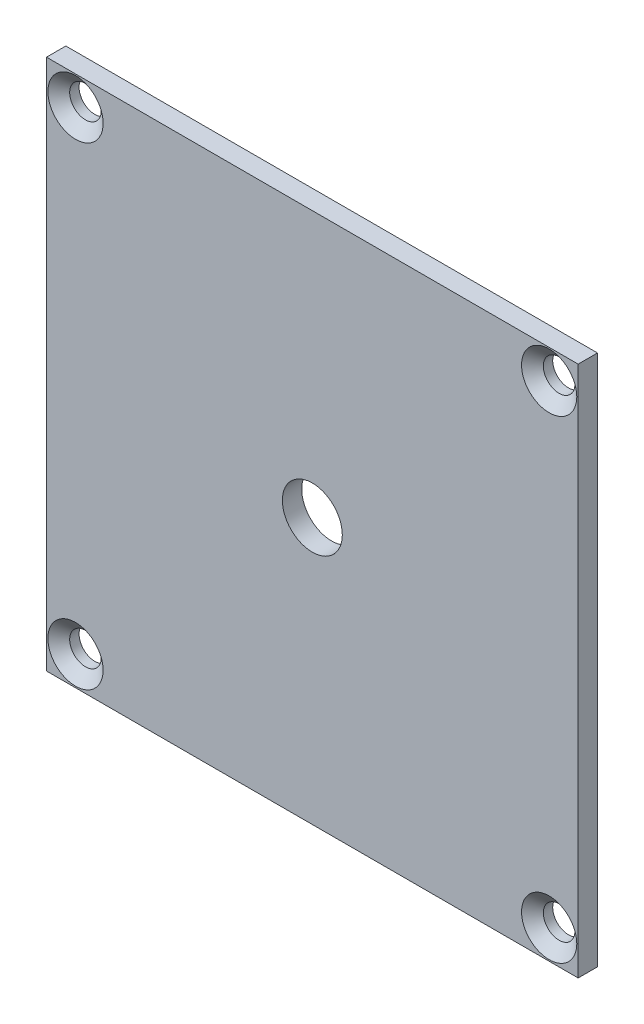
ISO-10303-21;
HEADER;
FILE_DESCRIPTION(('STEP AP214'),'2;1');
FILE_NAME('part.step','',(''),(''),'','','');
FILE_SCHEMA(('AUTOMOTIVE_DESIGN { 1 0 10303 214 1 1 1 1 }'));
ENDSEC;
DATA;
#1=APPLICATION_CONTEXT('core data for automotive mechanical design processes');
#2=APPLICATION_PROTOCOL_DEFINITION('international standard','automotive_design',2000,#1);
#3=PRODUCT_CONTEXT('',#1,'mechanical');
#4=PRODUCT('Part','Part','',(#3));
#5=PRODUCT_RELATED_PRODUCT_CATEGORY('part','',(#4));
#6=PRODUCT_DEFINITION_FORMATION('','',#4);
#7=PRODUCT_DEFINITION_CONTEXT('part definition',#1,'design');
#8=PRODUCT_DEFINITION('design','',#6,#7);
#9=PRODUCT_DEFINITION_SHAPE('','',#8);
#10=(LENGTH_UNIT() NAMED_UNIT(*) SI_UNIT(.MILLI.,.METRE.));
#11=(NAMED_UNIT(*) PLANE_ANGLE_UNIT() SI_UNIT($,.RADIAN.));
#12=(NAMED_UNIT(*) SI_UNIT($,.STERADIAN.) SOLID_ANGLE_UNIT());
#13=UNCERTAINTY_MEASURE_WITH_UNIT(LENGTH_MEASURE(1.E-05),#10,'distance_accuracy_value','');
#14=(GEOMETRIC_REPRESENTATION_CONTEXT(3) GLOBAL_UNCERTAINTY_ASSIGNED_CONTEXT((#13)) GLOBAL_UNIT_ASSIGNED_CONTEXT((#10,
#11,#12)) REPRESENTATION_CONTEXT('',''));
#15=CARTESIAN_POINT('',(0.,0.,0.));
#16=DIRECTION('',(0.,0.,1.));
#17=DIRECTION('',(1.,0.,0.));
#18=AXIS2_PLACEMENT_3D('',#15,#16,#17);
#19=CARTESIAN_POINT('',(0.,0.,2.));
#20=DIRECTION('',(1.,0.,0.));
#21=DIRECTION('',(0.,1.,0.));
#22=AXIS2_PLACEMENT_3D('',#19,#20,#21);
#23=PLANE('',#22);
#24=DIRECTION('',(0.,-1.,0.));
#25=VECTOR('',#24,1.);
#26=CARTESIAN_POINT('',(0.,0.,0.));
#27=LINE('',#26,#25);
#28=CARTESIAN_POINT('',(0.,55.,0.));
#29=VERTEX_POINT('',#28);
#30=CARTESIAN_POINT('',(0.,0.,0.));
#31=VERTEX_POINT('',#30);
#32=EDGE_CURVE('E107',#29,#31,#27,.T.);
#33=ORIENTED_EDGE('',*,*,#32,.T.);
#34=DIRECTION('',(0.,0.,-1.));
#35=VECTOR('',#34,1.);
#36=CARTESIAN_POINT('',(0.,0.,2.));
#37=LINE('',#36,#35);
#38=CARTESIAN_POINT('',(0.,0.,2.));
#39=VERTEX_POINT('',#38);
#40=EDGE_CURVE('E11',#39,#31,#37,.T.);
#41=ORIENTED_EDGE('',*,*,#40,.F.);
#42=DIRECTION('',(0.,-1.,0.));
#43=VECTOR('',#42,1.);
#44=CARTESIAN_POINT('',(0.,0.,2.));
#45=LINE('',#44,#43);
#46=CARTESIAN_POINT('',(0.,55.,2.));
#47=VERTEX_POINT('',#46);
#48=EDGE_CURVE('E91',#47,#39,#45,.T.);
#49=ORIENTED_EDGE('',*,*,#48,.F.);
#50=DIRECTION('',(0.,0.,-1.));
#51=VECTOR('',#50,1.);
#52=CARTESIAN_POINT('',(0.,55.,2.));
#53=LINE('',#52,#51);
#54=EDGE_CURVE('E103',#47,#29,#53,.T.);
#55=ORIENTED_EDGE('',*,*,#54,.T.);
#56=EDGE_LOOP('',(#33,#41,#49,#55));
#57=FACE_BOUND('',#56,.T.);
#58=ADVANCED_FACE('F39',(#57),#23,.F.);
#59=CARTESIAN_POINT('',(0.,0.,2.));
#60=DIRECTION('',(0.,1.,0.));
#61=DIRECTION('',(0.,0.,1.));
#62=AXIS2_PLACEMENT_3D('',#59,#60,#61);
#63=PLANE('',#62);
#64=DIRECTION('',(1.,0.,0.));
#65=VECTOR('',#64,1.);
#66=CARTESIAN_POINT('',(0.,0.,0.));
#67=LINE('',#66,#65);
#68=CARTESIAN_POINT('',(55.,0.,0.));
#69=VERTEX_POINT('',#68);
#70=EDGE_CURVE('E96',#31,#69,#67,.T.);
#71=ORIENTED_EDGE('',*,*,#70,.T.);
#72=DIRECTION('',(0.,0.,-1.));
#73=VECTOR('',#72,1.);
#74=CARTESIAN_POINT('',(55.,0.,2.));
#75=LINE('',#74,#73);
#76=CARTESIAN_POINT('',(55.,0.,2.));
#77=VERTEX_POINT('',#76);
#78=EDGE_CURVE('E48',#77,#69,#75,.T.);
#79=ORIENTED_EDGE('',*,*,#78,.F.);
#80=DIRECTION('',(1.,0.,0.));
#81=VECTOR('',#80,1.);
#82=CARTESIAN_POINT('',(0.,0.,2.));
#83=LINE('',#82,#81);
#84=EDGE_CURVE('E86',#39,#77,#83,.T.);
#85=ORIENTED_EDGE('',*,*,#84,.F.);
#86=ORIENTED_EDGE('',*,*,#40,.T.);
#87=EDGE_LOOP('',(#71,#79,#85,#86));
#88=FACE_BOUND('',#87,.T.);
#89=ADVANCED_FACE('F95',(#88),#63,.F.);
#90=CARTESIAN_POINT('',(55.,0.,2.));
#91=DIRECTION('',(-1.,0.,0.));
#92=DIRECTION('',(0.,-1.,0.));
#93=AXIS2_PLACEMENT_3D('',#90,#91,#92);
#94=PLANE('',#93);
#95=DIRECTION('',(0.,1.,0.));
#96=VECTOR('',#95,1.);
#97=CARTESIAN_POINT('',(55.,0.,0.));
#98=LINE('',#97,#96);
#99=CARTESIAN_POINT('',(55.,55.,0.));
#100=VERTEX_POINT('',#99);
#101=EDGE_CURVE('E73',#69,#100,#98,.T.);
#102=ORIENTED_EDGE('',*,*,#101,.T.);
#103=DIRECTION('',(0.,0.,-1.));
#104=VECTOR('',#103,1.);
#105=CARTESIAN_POINT('',(55.,55.,2.));
#106=LINE('',#105,#104);
#107=CARTESIAN_POINT('',(55.,55.,2.));
#108=VERTEX_POINT('',#107);
#109=EDGE_CURVE('E98',#108,#100,#106,.T.);
#110=ORIENTED_EDGE('',*,*,#109,.F.);
#111=DIRECTION('',(0.,1.,0.));
#112=VECTOR('',#111,1.);
#113=CARTESIAN_POINT('',(55.,0.,2.));
#114=LINE('',#113,#112);
#115=EDGE_CURVE('E89',#77,#108,#114,.T.);
#116=ORIENTED_EDGE('',*,*,#115,.F.);
#117=ORIENTED_EDGE('',*,*,#78,.T.);
#118=EDGE_LOOP('',(#102,#110,#116,#117));
#119=FACE_BOUND('',#118,.T.);
#120=ADVANCED_FACE('F99',(#119),#94,.F.);
#121=CARTESIAN_POINT('',(0.,55.,2.));
#122=DIRECTION('',(0.,-1.,0.));
#123=DIRECTION('',(0.,0.,-1.));
#124=AXIS2_PLACEMENT_3D('',#121,#122,#123);
#125=PLANE('',#124);
#126=DIRECTION('',(-1.,0.,0.));
#127=VECTOR('',#126,1.);
#128=CARTESIAN_POINT('',(0.,55.,0.));
#129=LINE('',#128,#127);
#130=EDGE_CURVE('E79',#100,#29,#129,.T.);
#131=ORIENTED_EDGE('',*,*,#130,.T.);
#132=ORIENTED_EDGE('',*,*,#54,.F.);
#133=DIRECTION('',(-1.,0.,0.));
#134=VECTOR('',#133,1.);
#135=CARTESIAN_POINT('',(0.,55.,2.));
#136=LINE('',#135,#134);
#137=EDGE_CURVE('E56',#108,#47,#136,.T.);
#138=ORIENTED_EDGE('',*,*,#137,.F.);
#139=ORIENTED_EDGE('',*,*,#109,.T.);
#140=EDGE_LOOP('',(#131,#132,#138,#139));
#141=FACE_BOUND('',#140,.T.);
#142=ADVANCED_FACE('F121',(#141),#125,.F.);
#143=CARTESIAN_POINT('',(0.,0.,2.));
#144=DIRECTION('',(0.,0.,-1.));
#145=DIRECTION('',(-1.,0.,0.));
#146=AXIS2_PLACEMENT_3D('',#143,#144,#145);
#147=PLANE('',#146);
#148=CARTESIAN_POINT('',(2.99999999999998,52.,2.));
#149=DIRECTION('',(0.,0.,1.));
#150=DIRECTION('',(1.,0.,0.));
#151=AXIS2_PLACEMENT_3D('',#148,#149,#150);
#152=CIRCLE('',#151,2.8575);
#153=CARTESIAN_POINT('',(5.85749999999998,52.,2.));
#154=VERTEX_POINT('',#153);
#155=EDGE_CURVE('E179',#154,#154,#152,.T.);
#156=ORIENTED_EDGE('',*,*,#155,.F.);
#157=EDGE_LOOP('',(#156));
#158=FACE_BOUND('',#157,.T.);
#159=CARTESIAN_POINT('',(52.,52.,2.));
#160=DIRECTION('',(0.,0.,1.));
#161=DIRECTION('',(1.,0.,0.));
#162=AXIS2_PLACEMENT_3D('',#159,#160,#161);
#163=CIRCLE('',#162,2.8575);
#164=CARTESIAN_POINT('',(54.8575,52.,2.));
#165=VERTEX_POINT('',#164);
#166=EDGE_CURVE('E167',#165,#165,#163,.T.);
#167=ORIENTED_EDGE('',*,*,#166,.F.);
#168=EDGE_LOOP('',(#167));
#169=FACE_BOUND('',#168,.T.);
#170=CARTESIAN_POINT('',(52.,3.00000000000001,2.));
#171=DIRECTION('',(0.,0.,1.));
#172=DIRECTION('',(1.,0.,0.));
#173=AXIS2_PLACEMENT_3D('',#170,#171,#172);
#174=CIRCLE('',#173,2.8575);
#175=CARTESIAN_POINT('',(54.8575,3.00000000000001,2.));
#176=VERTEX_POINT('',#175);
#177=EDGE_CURVE('E155',#176,#176,#174,.T.);
#178=ORIENTED_EDGE('',*,*,#177,.F.);
#179=EDGE_LOOP('',(#178));
#180=FACE_BOUND('',#179,.T.);
#181=CARTESIAN_POINT('',(2.99999999999998,3.00000000000001,2.));
#182=DIRECTION('',(0.,0.,1.));
#183=DIRECTION('',(1.,0.,0.));
#184=AXIS2_PLACEMENT_3D('',#181,#182,#183);
#185=CIRCLE('',#184,2.8575);
#186=CARTESIAN_POINT('',(5.85749999999998,3.00000000000001,2.));
#187=VERTEX_POINT('',#186);
#188=EDGE_CURVE('E143',#187,#187,#185,.T.);
#189=ORIENTED_EDGE('',*,*,#188,.F.);
#190=EDGE_LOOP('',(#189));
#191=FACE_BOUND('',#190,.T.);
#192=CARTESIAN_POINT('',(27.5,27.5,2.));
#193=DIRECTION('',(0.,0.,1.));
#194=DIRECTION('',(1.,0.,0.));
#195=AXIS2_PLACEMENT_3D('',#192,#193,#194);
#196=CIRCLE('',#195,3.1);
#197=CARTESIAN_POINT('',(30.6,27.5,2.));
#198=VERTEX_POINT('',#197);
#199=EDGE_CURVE('E128',#198,#198,#196,.T.);
#200=ORIENTED_EDGE('',*,*,#199,.F.);
#201=EDGE_LOOP('',(#200));
#202=FACE_BOUND('',#201,.T.);
#203=ORIENTED_EDGE('',*,*,#48,.T.);
#204=ORIENTED_EDGE('',*,*,#84,.T.);
#205=ORIENTED_EDGE('',*,*,#115,.T.);
#206=ORIENTED_EDGE('',*,*,#137,.T.);
#207=EDGE_LOOP('',(#203,#204,#205,#206));
#208=FACE_BOUND('',#207,.T.);
#209=ADVANCED_FACE('F87',(#158,#169,#180,#191,#202,#208),#147,.F.);
#210=CARTESIAN_POINT('',(0.,0.,0.));
#211=DIRECTION('',(0.,0.,-1.));
#212=DIRECTION('',(-1.,0.,0.));
#213=AXIS2_PLACEMENT_3D('',#210,#211,#212);
#214=PLANE('',#213);
#215=CARTESIAN_POINT('',(2.99999999999998,52.,0.));
#216=DIRECTION('',(0.,0.,1.));
#217=DIRECTION('',(1.,0.,0.));
#218=AXIS2_PLACEMENT_3D('',#215,#216,#217);
#219=CIRCLE('',#218,1.63195);
#220=CARTESIAN_POINT('',(4.63194999999998,52.,0.));
#221=VERTEX_POINT('',#220);
#222=EDGE_CURVE('E171',#221,#221,#219,.T.);
#223=ORIENTED_EDGE('',*,*,#222,.T.);
#224=EDGE_LOOP('',(#223));
#225=FACE_BOUND('',#224,.T.);
#226=CARTESIAN_POINT('',(52.,52.,0.));
#227=DIRECTION('',(0.,0.,1.));
#228=DIRECTION('',(1.,0.,0.));
#229=AXIS2_PLACEMENT_3D('',#226,#227,#228);
#230=CIRCLE('',#229,1.63195);
#231=CARTESIAN_POINT('',(53.63195,52.,0.));
#232=VERTEX_POINT('',#231);
#233=EDGE_CURVE('E159',#232,#232,#230,.T.);
#234=ORIENTED_EDGE('',*,*,#233,.T.);
#235=EDGE_LOOP('',(#234));
#236=FACE_BOUND('',#235,.T.);
#237=CARTESIAN_POINT('',(52.,3.00000000000001,0.));
#238=DIRECTION('',(0.,0.,1.));
#239=DIRECTION('',(1.,0.,0.));
#240=AXIS2_PLACEMENT_3D('',#237,#238,#239);
#241=CIRCLE('',#240,1.63195);
#242=CARTESIAN_POINT('',(53.63195,3.00000000000001,0.));
#243=VERTEX_POINT('',#242);
#244=EDGE_CURVE('E147',#243,#243,#241,.T.);
#245=ORIENTED_EDGE('',*,*,#244,.T.);
#246=EDGE_LOOP('',(#245));
#247=FACE_BOUND('',#246,.T.);
#248=CARTESIAN_POINT('',(2.99999999999998,3.00000000000001,0.));
#249=DIRECTION('',(0.,0.,1.));
#250=DIRECTION('',(1.,0.,0.));
#251=AXIS2_PLACEMENT_3D('',#248,#249,#250);
#252=CIRCLE('',#251,1.63195);
#253=CARTESIAN_POINT('',(4.63194999999998,3.00000000000001,0.));
#254=VERTEX_POINT('',#253);
#255=EDGE_CURVE('E132',#254,#254,#252,.T.);
#256=ORIENTED_EDGE('',*,*,#255,.T.);
#257=EDGE_LOOP('',(#256));
#258=FACE_BOUND('',#257,.T.);
#259=CARTESIAN_POINT('',(27.5,27.5,0.));
#260=DIRECTION('',(0.,0.,1.));
#261=DIRECTION('',(1.,0.,0.));
#262=AXIS2_PLACEMENT_3D('',#259,#260,#261);
#263=CIRCLE('',#262,3.1);
#264=CARTESIAN_POINT('',(30.6,27.5,0.));
#265=VERTEX_POINT('',#264);
#266=EDGE_CURVE('E111',#265,#265,#263,.T.);
#267=ORIENTED_EDGE('',*,*,#266,.T.);
#268=EDGE_LOOP('',(#267));
#269=FACE_BOUND('',#268,.T.);
#270=ORIENTED_EDGE('',*,*,#32,.F.);
#271=ORIENTED_EDGE('',*,*,#130,.F.);
#272=ORIENTED_EDGE('',*,*,#101,.F.);
#273=ORIENTED_EDGE('',*,*,#70,.F.);
#274=EDGE_LOOP('',(#270,#271,#272,#273));
#275=FACE_BOUND('',#274,.T.);
#276=ADVANCED_FACE('F124',(#225,#236,#247,#258,#269,#275),#214,.T.);
#277=CARTESIAN_POINT('',(27.5,27.5,0.));
#278=DIRECTION('',(0.,0.,1.));
#279=DIRECTION('',(1.,0.,0.));
#280=AXIS2_PLACEMENT_3D('',#277,#278,#279);
#281=CYLINDRICAL_SURFACE('',#280,3.1);
#282=ORIENTED_EDGE('',*,*,#266,.F.);
#283=EDGE_LOOP('',(#282));
#284=FACE_BOUND('',#283,.T.);
#285=ORIENTED_EDGE('',*,*,#199,.T.);
#286=EDGE_LOOP('',(#285));
#287=FACE_BOUND('',#286,.T.);
#288=ADVANCED_FACE('F197',(#284,#287),#281,.F.);
#289=CARTESIAN_POINT('',(2.99999999999998,3.00000000000001,2.));
#290=DIRECTION('',(0.,0.,1.));
#291=DIRECTION('',(1.,0.,0.));
#292=AXIS2_PLACEMENT_3D('',#289,#290,#291);
#293=CYLINDRICAL_SURFACE('',#292,1.63194999999999);
#294=ORIENTED_EDGE('',*,*,#255,.F.);
#295=EDGE_LOOP('',(#294));
#296=FACE_BOUND('',#295,.T.);
#297=CARTESIAN_POINT('',(2.99999999999998,3.00000000000001,0.971641447010672));
#298=DIRECTION('',(0.,0.,1.));
#299=DIRECTION('',(1.,0.,0.));
#300=AXIS2_PLACEMENT_3D('',#297,#298,#299);
#301=CIRCLE('',#300,1.63194999999999);
#302=CARTESIAN_POINT('',(4.63194999999997,3.00000000000001,0.971641447010672));
#303=VERTEX_POINT('',#302);
#304=EDGE_CURVE('E139',#303,#303,#301,.T.);
#305=ORIENTED_EDGE('',*,*,#304,.T.);
#306=EDGE_LOOP('',(#305));
#307=FACE_BOUND('',#306,.T.);
#308=ADVANCED_FACE('F199',(#296,#307),#293,.F.);
#309=CARTESIAN_POINT('',(2.99999999999998,3.00000000000001,2.));
#310=DIRECTION('',(0.,0.,1.));
#311=DIRECTION('',(1.,0.,0.));
#312=AXIS2_PLACEMENT_3D('',#309,#310,#311);
#313=CONICAL_SURFACE('',#312,2.8575,0.872664625997162);
#314=ORIENTED_EDGE('',*,*,#304,.F.);
#315=EDGE_LOOP('',(#314));
#316=FACE_BOUND('',#315,.T.);
#317=ORIENTED_EDGE('',*,*,#188,.T.);
#318=EDGE_LOOP('',(#317));
#319=FACE_BOUND('',#318,.T.);
#320=ADVANCED_FACE('F206',(#316,#319),#313,.F.);
#321=CARTESIAN_POINT('',(52.,3.00000000000001,2.));
#322=DIRECTION('',(0.,0.,1.));
#323=DIRECTION('',(1.,0.,0.));
#324=AXIS2_PLACEMENT_3D('',#321,#322,#323);
#325=CYLINDRICAL_SURFACE('',#324,1.63194999999999);
#326=ORIENTED_EDGE('',*,*,#244,.F.);
#327=EDGE_LOOP('',(#326));
#328=FACE_BOUND('',#327,.T.);
#329=CARTESIAN_POINT('',(52.,3.00000000000001,0.971641447010672));
#330=DIRECTION('',(0.,0.,1.));
#331=DIRECTION('',(1.,0.,0.));
#332=AXIS2_PLACEMENT_3D('',#329,#330,#331);
#333=CIRCLE('',#332,1.63194999999999);
#334=CARTESIAN_POINT('',(53.63195,3.00000000000001,0.971641447010672));
#335=VERTEX_POINT('',#334);
#336=EDGE_CURVE('E151',#335,#335,#333,.T.);
#337=ORIENTED_EDGE('',*,*,#336,.T.);
#338=EDGE_LOOP('',(#337));
#339=FACE_BOUND('',#338,.T.);
#340=ADVANCED_FACE('F250',(#328,#339),#325,.F.);
#341=CARTESIAN_POINT('',(52.,3.00000000000001,2.));
#342=DIRECTION('',(0.,0.,1.));
#343=DIRECTION('',(1.,0.,0.));
#344=AXIS2_PLACEMENT_3D('',#341,#342,#343);
#345=CONICAL_SURFACE('',#344,2.8575,0.872664625997163);
#346=ORIENTED_EDGE('',*,*,#336,.F.);
#347=EDGE_LOOP('',(#346));
#348=FACE_BOUND('',#347,.T.);
#349=ORIENTED_EDGE('',*,*,#177,.T.);
#350=EDGE_LOOP('',(#349));
#351=FACE_BOUND('',#350,.T.);
#352=ADVANCED_FACE('F260',(#348,#351),#345,.F.);
#353=CARTESIAN_POINT('',(52.,52.,2.));
#354=DIRECTION('',(0.,0.,1.));
#355=DIRECTION('',(1.,0.,0.));
#356=AXIS2_PLACEMENT_3D('',#353,#354,#355);
#357=CYLINDRICAL_SURFACE('',#356,1.63194999999999);
#358=ORIENTED_EDGE('',*,*,#233,.F.);
#359=EDGE_LOOP('',(#358));
#360=FACE_BOUND('',#359,.T.);
#361=CARTESIAN_POINT('',(52.,52.,0.971641447010672));
#362=DIRECTION('',(0.,0.,1.));
#363=DIRECTION('',(1.,0.,0.));
#364=AXIS2_PLACEMENT_3D('',#361,#362,#363);
#365=CIRCLE('',#364,1.63194999999999);
#366=CARTESIAN_POINT('',(53.63195,52.,0.971641447010672));
#367=VERTEX_POINT('',#366);
#368=EDGE_CURVE('E163',#367,#367,#365,.T.);
#369=ORIENTED_EDGE('',*,*,#368,.T.);
#370=EDGE_LOOP('',(#369));
#371=FACE_BOUND('',#370,.T.);
#372=ADVANCED_FACE('F270',(#360,#371),#357,.F.);
#373=CARTESIAN_POINT('',(52.,52.,2.));
#374=DIRECTION('',(0.,0.,1.));
#375=DIRECTION('',(1.,0.,0.));
#376=AXIS2_PLACEMENT_3D('',#373,#374,#375);
#377=CONICAL_SURFACE('',#376,2.8575,0.872664625997163);
#378=ORIENTED_EDGE('',*,*,#368,.F.);
#379=EDGE_LOOP('',(#378));
#380=FACE_BOUND('',#379,.T.);
#381=ORIENTED_EDGE('',*,*,#166,.T.);
#382=EDGE_LOOP('',(#381));
#383=FACE_BOUND('',#382,.T.);
#384=ADVANCED_FACE('F280',(#380,#383),#377,.F.);
#385=CARTESIAN_POINT('',(2.99999999999998,52.,2.));
#386=DIRECTION('',(0.,0.,1.));
#387=DIRECTION('',(1.,0.,0.));
#388=AXIS2_PLACEMENT_3D('',#385,#386,#387);
#389=CYLINDRICAL_SURFACE('',#388,1.63194999999999);
#390=ORIENTED_EDGE('',*,*,#222,.F.);
#391=EDGE_LOOP('',(#390));
#392=FACE_BOUND('',#391,.T.);
#393=CARTESIAN_POINT('',(2.99999999999998,52.,0.971641447010672));
#394=DIRECTION('',(0.,0.,1.));
#395=DIRECTION('',(1.,0.,0.));
#396=AXIS2_PLACEMENT_3D('',#393,#394,#395);
#397=CIRCLE('',#396,1.63194999999999);
#398=CARTESIAN_POINT('',(4.63194999999996,52.,0.971641447010672));
#399=VERTEX_POINT('',#398);
#400=EDGE_CURVE('E175',#399,#399,#397,.T.);
#401=ORIENTED_EDGE('',*,*,#400,.T.);
#402=EDGE_LOOP('',(#401));
#403=FACE_BOUND('',#402,.T.);
#404=ADVANCED_FACE('F290',(#392,#403),#389,.F.);
#405=CARTESIAN_POINT('',(2.99999999999998,52.,2.));
#406=DIRECTION('',(0.,0.,1.));
#407=DIRECTION('',(1.,0.,0.));
#408=AXIS2_PLACEMENT_3D('',#405,#406,#407);
#409=CONICAL_SURFACE('',#408,2.8575,0.872664625997162);
#410=ORIENTED_EDGE('',*,*,#400,.F.);
#411=EDGE_LOOP('',(#410));
#412=FACE_BOUND('',#411,.T.);
#413=ORIENTED_EDGE('',*,*,#155,.T.);
#414=EDGE_LOOP('',(#413));
#415=FACE_BOUND('',#414,.T.);
#416=ADVANCED_FACE('F184',(#412,#415),#409,.F.);
#417=CLOSED_SHELL('',(#58,#89,#120,#142,#209,#276,#288,#308,#320,#340,#352,#372,#384,#404,#416));
#418=MANIFOLD_SOLID_BREP('B2',#417);
#419=ADVANCED_BREP_SHAPE_REPRESENTATION('',(#18,#418),#14);
#420=SHAPE_DEFINITION_REPRESENTATION(#9,#419);
ENDSEC;
END-ISO-10303-21;
